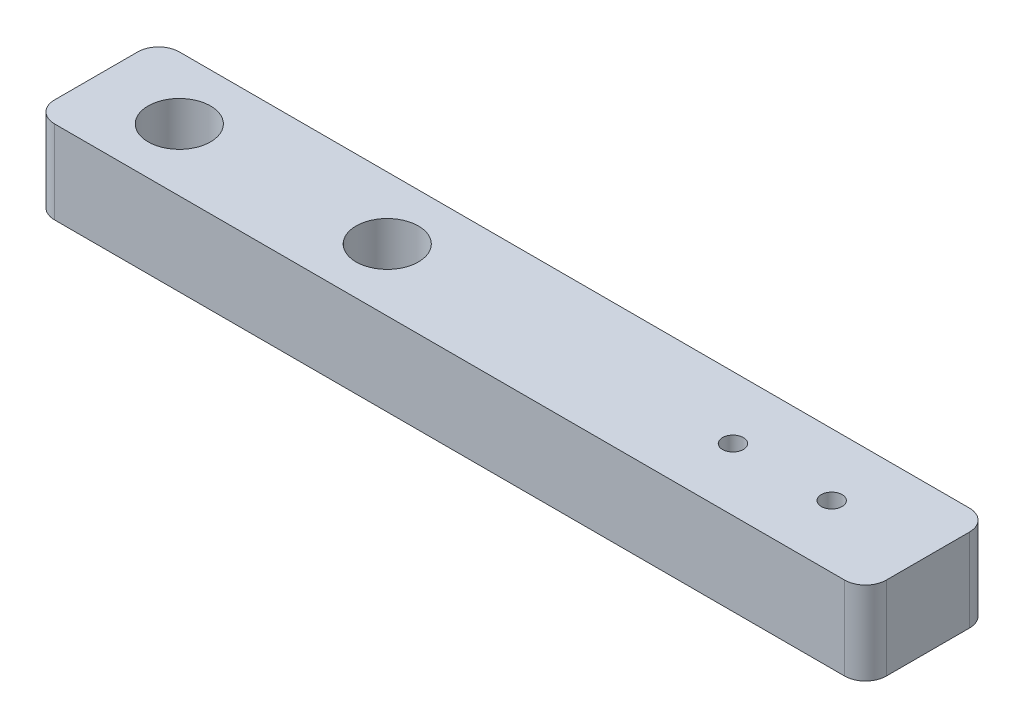
ISO-10303-21;
HEADER;
FILE_DESCRIPTION(('STEP AP214'),'2;1');
FILE_NAME('part.step','',(''),(''),'','','');
FILE_SCHEMA(('AUTOMOTIVE_DESIGN { 1 0 10303 214 1 1 1 1 }'));
ENDSEC;
DATA;
#1=APPLICATION_CONTEXT('core data for automotive mechanical design processes');
#2=APPLICATION_PROTOCOL_DEFINITION('international standard','automotive_design',2000,#1);
#3=PRODUCT_CONTEXT('',#1,'mechanical');
#4=PRODUCT('Part','Part','',(#3));
#5=PRODUCT_RELATED_PRODUCT_CATEGORY('part','',(#4));
#6=PRODUCT_DEFINITION_FORMATION('','',#4);
#7=PRODUCT_DEFINITION_CONTEXT('part definition',#1,'design');
#8=PRODUCT_DEFINITION('design','',#6,#7);
#9=PRODUCT_DEFINITION_SHAPE('','',#8);
#10=(LENGTH_UNIT() NAMED_UNIT(*) SI_UNIT(.MILLI.,.METRE.));
#11=(NAMED_UNIT(*) PLANE_ANGLE_UNIT() SI_UNIT($,.RADIAN.));
#12=(NAMED_UNIT(*) SI_UNIT($,.STERADIAN.) SOLID_ANGLE_UNIT());
#13=UNCERTAINTY_MEASURE_WITH_UNIT(LENGTH_MEASURE(1.E-05),#10,'distance_accuracy_value','');
#14=(GEOMETRIC_REPRESENTATION_CONTEXT(3) GLOBAL_UNCERTAINTY_ASSIGNED_CONTEXT((#13)) GLOBAL_UNIT_ASSIGNED_CONTEXT((#10,
#11,#12)) REPRESENTATION_CONTEXT('',''));
#15=CARTESIAN_POINT('',(0.,0.,0.));
#16=DIRECTION('',(0.,0.,1.));
#17=DIRECTION('',(1.,0.,0.));
#18=AXIS2_PLACEMENT_3D('',#15,#16,#17);
#19=CARTESIAN_POINT('',(40.,8.,6.));
#20=DIRECTION('',(-1.,0.,0.));
#21=DIRECTION('',(0.,0.,1.));
#22=AXIS2_PLACEMENT_3D('',#19,#20,#21);
#23=PLANE('',#22);
#24=DIRECTION('',(0.,0.,-1.));
#25=VECTOR('',#24,1.);
#26=CARTESIAN_POINT('',(40.,0.,6.));
#27=LINE('',#26,#25);
#28=CARTESIAN_POINT('',(40.,0.,4.));
#29=VERTEX_POINT('',#28);
#30=CARTESIAN_POINT('',(40.,0.,-4.));
#31=VERTEX_POINT('',#30);
#32=EDGE_CURVE('E140',#29,#31,#27,.T.);
#33=ORIENTED_EDGE('',*,*,#32,.T.);
#34=DIRECTION('',(0.,-1.,0.));
#35=VECTOR('',#34,1.);
#36=CARTESIAN_POINT('',(40.,8.,-4.));
#37=LINE('',#36,#35);
#38=CARTESIAN_POINT('',(40.,8.,-4.));
#39=VERTEX_POINT('',#38);
#40=EDGE_CURVE('E174',#31,#39,#37,.F.);
#41=ORIENTED_EDGE('',*,*,#40,.T.);
#42=DIRECTION('',(0.,0.,-1.));
#43=VECTOR('',#42,1.);
#44=CARTESIAN_POINT('',(40.,8.,6.));
#45=LINE('',#44,#43);
#46=CARTESIAN_POINT('',(40.,8.,4.));
#47=VERTEX_POINT('',#46);
#48=EDGE_CURVE('E138',#47,#39,#45,.T.);
#49=ORIENTED_EDGE('',*,*,#48,.F.);
#50=DIRECTION('',(0.,-1.,0.));
#51=VECTOR('',#50,1.);
#52=CARTESIAN_POINT('',(40.,8.,4.));
#53=LINE('',#52,#51);
#54=EDGE_CURVE('E170',#47,#29,#53,.T.);
#55=ORIENTED_EDGE('',*,*,#54,.T.);
#56=EDGE_LOOP('',(#33,#41,#49,#55));
#57=FACE_BOUND('',#56,.T.);
#58=ADVANCED_FACE('F39',(#57),#23,.F.);
#59=CARTESIAN_POINT('',(-40.,8.,-6.));
#60=DIRECTION('',(0.,0.,1.));
#61=DIRECTION('',(1.,0.,0.));
#62=AXIS2_PLACEMENT_3D('',#59,#60,#61);
#63=PLANE('',#62);
#64=DIRECTION('',(-1.,0.,0.));
#65=VECTOR('',#64,1.);
#66=CARTESIAN_POINT('',(-40.,0.,-6.));
#67=LINE('',#66,#65);
#68=CARTESIAN_POINT('',(38.,0.,-6.));
#69=VERTEX_POINT('',#68);
#70=CARTESIAN_POINT('',(-38.,0.,-6.));
#71=VERTEX_POINT('',#70);
#72=EDGE_CURVE('E134',#69,#71,#67,.T.);
#73=ORIENTED_EDGE('',*,*,#72,.T.);
#74=DIRECTION('',(0.,-1.,0.));
#75=VECTOR('',#74,1.);
#76=CARTESIAN_POINT('',(-38.,8.,-6.));
#77=LINE('',#76,#75);
#78=CARTESIAN_POINT('',(-38.,8.,-6.));
#79=VERTEX_POINT('',#78);
#80=EDGE_CURVE('E110',#71,#79,#77,.F.);
#81=ORIENTED_EDGE('',*,*,#80,.T.);
#82=DIRECTION('',(-1.,0.,0.));
#83=VECTOR('',#82,1.);
#84=CARTESIAN_POINT('',(-40.,8.,-6.));
#85=LINE('',#84,#83);
#86=CARTESIAN_POINT('',(38.,8.,-6.));
#87=VERTEX_POINT('',#86);
#88=EDGE_CURVE('E193',#87,#79,#85,.T.);
#89=ORIENTED_EDGE('',*,*,#88,.F.);
#90=DIRECTION('',(0.,-1.,0.));
#91=VECTOR('',#90,1.);
#92=CARTESIAN_POINT('',(38.,8.,-6.));
#93=LINE('',#92,#91);
#94=EDGE_CURVE('E116',#87,#69,#93,.T.);
#95=ORIENTED_EDGE('',*,*,#94,.T.);
#96=EDGE_LOOP('',(#73,#81,#89,#95));
#97=FACE_BOUND('',#96,.T.);
#98=ADVANCED_FACE('F250',(#97),#63,.F.);
#99=CARTESIAN_POINT('',(-40.,8.,6.));
#100=DIRECTION('',(1.,0.,0.));
#101=DIRECTION('',(0.,0.,-1.));
#102=AXIS2_PLACEMENT_3D('',#99,#100,#101);
#103=PLANE('',#102);
#104=DIRECTION('',(0.,0.,1.));
#105=VECTOR('',#104,1.);
#106=CARTESIAN_POINT('',(-40.,8.,6.));
#107=LINE('',#106,#105);
#108=CARTESIAN_POINT('',(-40.,8.,-4.));
#109=VERTEX_POINT('',#108);
#110=CARTESIAN_POINT('',(-40.,8.,4.));
#111=VERTEX_POINT('',#110);
#112=EDGE_CURVE('E125',#109,#111,#107,.T.);
#113=ORIENTED_EDGE('',*,*,#112,.F.);
#114=DIRECTION('',(0.,-1.,0.));
#115=VECTOR('',#114,1.);
#116=CARTESIAN_POINT('',(-40.,8.,-4.));
#117=LINE('',#116,#115);
#118=CARTESIAN_POINT('',(-40.,0.,-4.));
#119=VERTEX_POINT('',#118);
#120=EDGE_CURVE('E109',#109,#119,#117,.T.);
#121=ORIENTED_EDGE('',*,*,#120,.T.);
#122=DIRECTION('',(0.,0.,1.));
#123=VECTOR('',#122,1.);
#124=CARTESIAN_POINT('',(-40.,0.,6.));
#125=LINE('',#124,#123);
#126=CARTESIAN_POINT('',(-40.,0.,4.));
#127=VERTEX_POINT('',#126);
#128=EDGE_CURVE('E123',#119,#127,#125,.T.);
#129=ORIENTED_EDGE('',*,*,#128,.T.);
#130=DIRECTION('',(0.,-1.,0.));
#131=VECTOR('',#130,1.);
#132=CARTESIAN_POINT('',(-40.,8.,4.));
#133=LINE('',#132,#131);
#134=EDGE_CURVE('E128',#127,#111,#133,.F.);
#135=ORIENTED_EDGE('',*,*,#134,.T.);
#136=EDGE_LOOP('',(#113,#121,#129,#135));
#137=FACE_BOUND('',#136,.T.);
#138=ADVANCED_FACE('F122',(#137),#103,.F.);
#139=CARTESIAN_POINT('',(-40.,8.,6.));
#140=DIRECTION('',(0.,0.,-1.));
#141=DIRECTION('',(-1.,0.,0.));
#142=AXIS2_PLACEMENT_3D('',#139,#140,#141);
#143=PLANE('',#142);
#144=DIRECTION('',(1.,0.,0.));
#145=VECTOR('',#144,1.);
#146=CARTESIAN_POINT('',(-40.,0.,6.));
#147=LINE('',#146,#145);
#148=CARTESIAN_POINT('',(-38.,0.,6.));
#149=VERTEX_POINT('',#148);
#150=CARTESIAN_POINT('',(38.,0.,6.));
#151=VERTEX_POINT('',#150);
#152=EDGE_CURVE('E133',#149,#151,#147,.T.);
#153=ORIENTED_EDGE('',*,*,#152,.T.);
#154=DIRECTION('',(0.,-1.,0.));
#155=VECTOR('',#154,1.);
#156=CARTESIAN_POINT('',(38.,8.,6.));
#157=LINE('',#156,#155);
#158=CARTESIAN_POINT('',(38.,8.,6.));
#159=VERTEX_POINT('',#158);
#160=EDGE_CURVE('E11',#151,#159,#157,.F.);
#161=ORIENTED_EDGE('',*,*,#160,.T.);
#162=DIRECTION('',(1.,0.,0.));
#163=VECTOR('',#162,1.);
#164=CARTESIAN_POINT('',(-40.,8.,6.));
#165=LINE('',#164,#163);
#166=CARTESIAN_POINT('',(-38.,8.,6.));
#167=VERTEX_POINT('',#166);
#168=EDGE_CURVE('E145',#167,#159,#165,.T.);
#169=ORIENTED_EDGE('',*,*,#168,.F.);
#170=DIRECTION('',(0.,-1.,0.));
#171=VECTOR('',#170,1.);
#172=CARTESIAN_POINT('',(-38.,8.,6.));
#173=LINE('',#172,#171);
#174=EDGE_CURVE('E48',#167,#149,#173,.T.);
#175=ORIENTED_EDGE('',*,*,#174,.T.);
#176=EDGE_LOOP('',(#153,#161,#169,#175));
#177=FACE_BOUND('',#176,.T.);
#178=ADVANCED_FACE('F179',(#177),#143,.F.);
#179=CARTESIAN_POINT('',(0.,8.,0.));
#180=DIRECTION('',(0.,-1.,0.));
#181=DIRECTION('',(0.,0.,-1.));
#182=AXIS2_PLACEMENT_3D('',#179,#180,#181);
#183=PLANE('',#182);
#184=CARTESIAN_POINT('',(-32.,8.,0.));
#185=DIRECTION('',(0.,1.,0.));
#186=DIRECTION('',(0.,0.,1.));
#187=AXIS2_PLACEMENT_3D('',#184,#185,#186);
#188=CIRCLE('',#187,3.);
#189=CARTESIAN_POINT('',(-32.,8.,3.));
#190=VERTEX_POINT('',#189);
#191=EDGE_CURVE('E209',#190,#190,#188,.T.);
#192=ORIENTED_EDGE('',*,*,#191,.F.);
#193=EDGE_LOOP('',(#192));
#194=FACE_BOUND('',#193,.T.);
#195=CARTESIAN_POINT('',(-12.,8.,0.));
#196=DIRECTION('',(0.,1.,0.));
#197=DIRECTION('',(0.,0.,1.));
#198=AXIS2_PLACEMENT_3D('',#195,#196,#197);
#199=CIRCLE('',#198,3.);
#200=CARTESIAN_POINT('',(-12.,8.,3.));
#201=VERTEX_POINT('',#200);
#202=EDGE_CURVE('E221',#201,#201,#199,.T.);
#203=ORIENTED_EDGE('',*,*,#202,.F.);
#204=EDGE_LOOP('',(#203));
#205=FACE_BOUND('',#204,.T.);
#206=CARTESIAN_POINT('',(21.25,8.,0.));
#207=DIRECTION('',(0.,1.,0.));
#208=DIRECTION('',(0.,0.,1.));
#209=AXIS2_PLACEMENT_3D('',#206,#207,#208);
#210=CIRCLE('',#209,1.);
#211=CARTESIAN_POINT('',(21.25,8.,1.));
#212=VERTEX_POINT('',#211);
#213=EDGE_CURVE('E229',#212,#212,#210,.T.);
#214=ORIENTED_EDGE('',*,*,#213,.F.);
#215=EDGE_LOOP('',(#214));
#216=FACE_BOUND('',#215,.T.);
#217=CARTESIAN_POINT('',(30.75,8.,0.));
#218=DIRECTION('',(0.,1.,0.));
#219=DIRECTION('',(0.,0.,1.));
#220=AXIS2_PLACEMENT_3D('',#217,#218,#219);
#221=CIRCLE('',#220,0.999999999999998);
#222=CARTESIAN_POINT('',(30.75,8.,0.999999999999996));
#223=VERTEX_POINT('',#222);
#224=EDGE_CURVE('E199',#223,#223,#221,.T.);
#225=ORIENTED_EDGE('',*,*,#224,.F.);
#226=EDGE_LOOP('',(#225));
#227=FACE_BOUND('',#226,.T.);
#228=ORIENTED_EDGE('',*,*,#88,.T.);
#229=CARTESIAN_POINT('',(-38.,8.,-4.));
#230=DIRECTION('',(0.,-1.,0.));
#231=DIRECTION('',(0.,0.,-1.));
#232=AXIS2_PLACEMENT_3D('',#229,#230,#231);
#233=CIRCLE('',#232,2.);
#234=EDGE_CURVE('E167',#79,#109,#233,.F.);
#235=ORIENTED_EDGE('',*,*,#234,.T.);
#236=ORIENTED_EDGE('',*,*,#112,.T.);
#237=CARTESIAN_POINT('',(-38.,8.,4.));
#238=DIRECTION('',(0.,-1.,0.));
#239=DIRECTION('',(0.,0.,-1.));
#240=AXIS2_PLACEMENT_3D('',#237,#238,#239);
#241=CIRCLE('',#240,2.);
#242=EDGE_CURVE('E60',#111,#167,#241,.F.);
#243=ORIENTED_EDGE('',*,*,#242,.T.);
#244=ORIENTED_EDGE('',*,*,#168,.T.);
#245=CARTESIAN_POINT('',(38.,8.,4.));
#246=DIRECTION('',(0.,-1.,0.));
#247=DIRECTION('',(0.,0.,-1.));
#248=AXIS2_PLACEMENT_3D('',#245,#246,#247);
#249=CIRCLE('',#248,2.);
#250=EDGE_CURVE('E161',#159,#47,#249,.F.);
#251=ORIENTED_EDGE('',*,*,#250,.T.);
#252=ORIENTED_EDGE('',*,*,#48,.T.);
#253=CARTESIAN_POINT('',(38.,8.,-4.));
#254=DIRECTION('',(0.,-1.,0.));
#255=DIRECTION('',(0.,0.,-1.));
#256=AXIS2_PLACEMENT_3D('',#253,#254,#255);
#257=CIRCLE('',#256,2.);
#258=EDGE_CURVE('E164',#39,#87,#257,.F.);
#259=ORIENTED_EDGE('',*,*,#258,.T.);
#260=EDGE_LOOP('',(#228,#235,#236,#243,#244,#251,#252,#259));
#261=FACE_BOUND('',#260,.T.);
#262=ADVANCED_FACE('F243',(#194,#205,#216,#227,#261),#183,.F.);
#263=CARTESIAN_POINT('',(0.,0.,0.));
#264=DIRECTION('',(0.,-1.,0.));
#265=DIRECTION('',(0.,0.,-1.));
#266=AXIS2_PLACEMENT_3D('',#263,#264,#265);
#267=PLANE('',#266);
#268=CARTESIAN_POINT('',(-32.,0.,0.));
#269=DIRECTION('',(0.,1.,0.));
#270=DIRECTION('',(0.,0.,1.));
#271=AXIS2_PLACEMENT_3D('',#268,#269,#270);
#272=CIRCLE('',#271,3.);
#273=CARTESIAN_POINT('',(-32.,0.,3.));
#274=VERTEX_POINT('',#273);
#275=EDGE_CURVE('E206',#274,#274,#272,.T.);
#276=ORIENTED_EDGE('',*,*,#275,.T.);
#277=EDGE_LOOP('',(#276));
#278=FACE_BOUND('',#277,.T.);
#279=CARTESIAN_POINT('',(-12.,0.,0.));
#280=DIRECTION('',(0.,1.,0.));
#281=DIRECTION('',(0.,0.,1.));
#282=AXIS2_PLACEMENT_3D('',#279,#280,#281);
#283=CIRCLE('',#282,3.);
#284=CARTESIAN_POINT('',(-12.,0.,3.));
#285=VERTEX_POINT('',#284);
#286=EDGE_CURVE('E215',#285,#285,#283,.T.);
#287=ORIENTED_EDGE('',*,*,#286,.T.);
#288=EDGE_LOOP('',(#287));
#289=FACE_BOUND('',#288,.T.);
#290=CARTESIAN_POINT('',(21.25,0.,0.));
#291=DIRECTION('',(0.,1.,0.));
#292=DIRECTION('',(0.,0.,1.));
#293=AXIS2_PLACEMENT_3D('',#290,#291,#292);
#294=CIRCLE('',#293,1.);
#295=CARTESIAN_POINT('',(21.25,0.,1.));
#296=VERTEX_POINT('',#295);
#297=EDGE_CURVE('E225',#296,#296,#294,.T.);
#298=ORIENTED_EDGE('',*,*,#297,.T.);
#299=EDGE_LOOP('',(#298));
#300=FACE_BOUND('',#299,.T.);
#301=CARTESIAN_POINT('',(30.75,0.,0.));
#302=DIRECTION('',(0.,1.,0.));
#303=DIRECTION('',(0.,0.,1.));
#304=AXIS2_PLACEMENT_3D('',#301,#302,#303);
#305=CIRCLE('',#304,0.999999999999998);
#306=CARTESIAN_POINT('',(30.75,0.,0.999999999999996));
#307=VERTEX_POINT('',#306);
#308=EDGE_CURVE('E232',#307,#307,#305,.T.);
#309=ORIENTED_EDGE('',*,*,#308,.T.);
#310=EDGE_LOOP('',(#309));
#311=FACE_BOUND('',#310,.T.);
#312=ORIENTED_EDGE('',*,*,#128,.F.);
#313=CARTESIAN_POINT('',(-38.,0.,-4.));
#314=DIRECTION('',(0.,-1.,0.));
#315=DIRECTION('',(0.,0.,-1.));
#316=AXIS2_PLACEMENT_3D('',#313,#314,#315);
#317=CIRCLE('',#316,2.);
#318=EDGE_CURVE('E105',#119,#71,#317,.T.);
#319=ORIENTED_EDGE('',*,*,#318,.T.);
#320=ORIENTED_EDGE('',*,*,#72,.F.);
#321=CARTESIAN_POINT('',(38.,0.,-4.));
#322=DIRECTION('',(0.,-1.,0.));
#323=DIRECTION('',(0.,0.,-1.));
#324=AXIS2_PLACEMENT_3D('',#321,#322,#323);
#325=CIRCLE('',#324,2.);
#326=EDGE_CURVE('E117',#69,#31,#325,.T.);
#327=ORIENTED_EDGE('',*,*,#326,.T.);
#328=ORIENTED_EDGE('',*,*,#32,.F.);
#329=CARTESIAN_POINT('',(38.,0.,4.));
#330=DIRECTION('',(0.,-1.,0.));
#331=DIRECTION('',(0.,0.,-1.));
#332=AXIS2_PLACEMENT_3D('',#329,#330,#331);
#333=CIRCLE('',#332,2.);
#334=EDGE_CURVE('E149',#29,#151,#333,.T.);
#335=ORIENTED_EDGE('',*,*,#334,.T.);
#336=ORIENTED_EDGE('',*,*,#152,.F.);
#337=CARTESIAN_POINT('',(-38.,0.,4.));
#338=DIRECTION('',(0.,-1.,0.));
#339=DIRECTION('',(0.,0.,-1.));
#340=AXIS2_PLACEMENT_3D('',#337,#338,#339);
#341=CIRCLE('',#340,2.);
#342=EDGE_CURVE('E127',#149,#127,#341,.T.);
#343=ORIENTED_EDGE('',*,*,#342,.T.);
#344=EDGE_LOOP('',(#312,#319,#320,#327,#328,#335,#336,#343));
#345=FACE_BOUND('',#344,.T.);
#346=ADVANCED_FACE('F130',(#278,#289,#300,#311,#345),#267,.T.);
#347=CARTESIAN_POINT('',(30.75,0.,0.));
#348=DIRECTION('',(0.,1.,0.));
#349=DIRECTION('',(0.,0.,1.));
#350=AXIS2_PLACEMENT_3D('',#347,#348,#349);
#351=CYLINDRICAL_SURFACE('',#350,0.999999999999998);
#352=ORIENTED_EDGE('',*,*,#308,.F.);
#353=EDGE_LOOP('',(#352));
#354=FACE_BOUND('',#353,.T.);
#355=ORIENTED_EDGE('',*,*,#224,.T.);
#356=EDGE_LOOP('',(#355));
#357=FACE_BOUND('',#356,.T.);
#358=ADVANCED_FACE('F241',(#354,#357),#351,.F.);
#359=CARTESIAN_POINT('',(21.25,0.,0.));
#360=DIRECTION('',(0.,1.,0.));
#361=DIRECTION('',(0.,0.,1.));
#362=AXIS2_PLACEMENT_3D('',#359,#360,#361);
#363=CYLINDRICAL_SURFACE('',#362,1.);
#364=ORIENTED_EDGE('',*,*,#297,.F.);
#365=EDGE_LOOP('',(#364));
#366=FACE_BOUND('',#365,.T.);
#367=ORIENTED_EDGE('',*,*,#213,.T.);
#368=EDGE_LOOP('',(#367));
#369=FACE_BOUND('',#368,.T.);
#370=ADVANCED_FACE('F276',(#366,#369),#363,.F.);
#371=CARTESIAN_POINT('',(-12.,0.,0.));
#372=DIRECTION('',(0.,1.,0.));
#373=DIRECTION('',(0.,0.,1.));
#374=AXIS2_PLACEMENT_3D('',#371,#372,#373);
#375=CYLINDRICAL_SURFACE('',#374,3.);
#376=ORIENTED_EDGE('',*,*,#286,.F.);
#377=EDGE_LOOP('',(#376));
#378=FACE_BOUND('',#377,.T.);
#379=ORIENTED_EDGE('',*,*,#202,.T.);
#380=EDGE_LOOP('',(#379));
#381=FACE_BOUND('',#380,.T.);
#382=ADVANCED_FACE('F280',(#378,#381),#375,.F.);
#383=CARTESIAN_POINT('',(-32.,0.,0.));
#384=DIRECTION('',(0.,1.,0.));
#385=DIRECTION('',(0.,0.,1.));
#386=AXIS2_PLACEMENT_3D('',#383,#384,#385);
#387=CYLINDRICAL_SURFACE('',#386,3.);
#388=ORIENTED_EDGE('',*,*,#275,.F.);
#389=EDGE_LOOP('',(#388));
#390=FACE_BOUND('',#389,.T.);
#391=ORIENTED_EDGE('',*,*,#191,.T.);
#392=EDGE_LOOP('',(#391));
#393=FACE_BOUND('',#392,.T.);
#394=ADVANCED_FACE('F259',(#390,#393),#387,.F.);
#395=CARTESIAN_POINT('',(-38.,8.,-4.));
#396=DIRECTION('',(0.,-1.,0.));
#397=DIRECTION('',(0.,0.,-1.));
#398=AXIS2_PLACEMENT_3D('',#395,#396,#397);
#399=CYLINDRICAL_SURFACE('',#398,2.);
#400=ORIENTED_EDGE('',*,*,#234,.F.);
#401=ORIENTED_EDGE('',*,*,#80,.F.);
#402=ORIENTED_EDGE('',*,*,#318,.F.);
#403=ORIENTED_EDGE('',*,*,#120,.F.);
#404=EDGE_LOOP('',(#400,#401,#402,#403));
#405=FACE_BOUND('',#404,.T.);
#406=ADVANCED_FACE('F108',(#405),#399,.T.);
#407=CARTESIAN_POINT('',(38.,8.,-4.));
#408=DIRECTION('',(0.,-1.,0.));
#409=DIRECTION('',(0.,0.,-1.));
#410=AXIS2_PLACEMENT_3D('',#407,#408,#409);
#411=CYLINDRICAL_SURFACE('',#410,2.);
#412=ORIENTED_EDGE('',*,*,#258,.F.);
#413=ORIENTED_EDGE('',*,*,#40,.F.);
#414=ORIENTED_EDGE('',*,*,#326,.F.);
#415=ORIENTED_EDGE('',*,*,#94,.F.);
#416=EDGE_LOOP('',(#412,#413,#414,#415));
#417=FACE_BOUND('',#416,.T.);
#418=ADVANCED_FACE('F252',(#417),#411,.T.);
#419=CARTESIAN_POINT('',(38.,8.,4.));
#420=DIRECTION('',(0.,-1.,0.));
#421=DIRECTION('',(0.,0.,-1.));
#422=AXIS2_PLACEMENT_3D('',#419,#420,#421);
#423=CYLINDRICAL_SURFACE('',#422,2.);
#424=ORIENTED_EDGE('',*,*,#250,.F.);
#425=ORIENTED_EDGE('',*,*,#160,.F.);
#426=ORIENTED_EDGE('',*,*,#334,.F.);
#427=ORIENTED_EDGE('',*,*,#54,.F.);
#428=EDGE_LOOP('',(#424,#425,#426,#427));
#429=FACE_BOUND('',#428,.T.);
#430=ADVANCED_FACE('F186',(#429),#423,.T.);
#431=CARTESIAN_POINT('',(-38.,8.,4.));
#432=DIRECTION('',(0.,-1.,0.));
#433=DIRECTION('',(0.,0.,-1.));
#434=AXIS2_PLACEMENT_3D('',#431,#432,#433);
#435=CYLINDRICAL_SURFACE('',#434,2.);
#436=ORIENTED_EDGE('',*,*,#242,.F.);
#437=ORIENTED_EDGE('',*,*,#134,.F.);
#438=ORIENTED_EDGE('',*,*,#342,.F.);
#439=ORIENTED_EDGE('',*,*,#174,.F.);
#440=EDGE_LOOP('',(#436,#437,#438,#439));
#441=FACE_BOUND('',#440,.T.);
#442=ADVANCED_FACE('F41',(#441),#435,.T.);
#443=CLOSED_SHELL('',(#58,#98,#138,#178,#262,#346,#358,#370,#382,#394,#406,#418,#430,#442));
#444=MANIFOLD_SOLID_BREP('B2',#443);
#445=ADVANCED_BREP_SHAPE_REPRESENTATION('',(#18,#444),#14);
#446=SHAPE_DEFINITION_REPRESENTATION(#9,#445);
ENDSEC;
END-ISO-10303-21;
